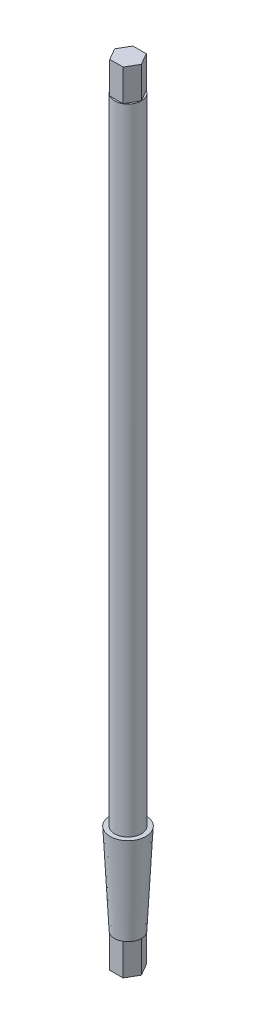
ISO-10303-21;
HEADER;
FILE_DESCRIPTION(('STEP AP214'),'2;1');
FILE_NAME('part.step','',(''),(''),'','','');
FILE_SCHEMA(('AUTOMOTIVE_DESIGN { 1 0 10303 214 1 1 1 1 }'));
ENDSEC;
DATA;
#1=APPLICATION_CONTEXT('core data for automotive mechanical design processes');
#2=APPLICATION_PROTOCOL_DEFINITION('international standard','automotive_design',2000,#1);
#3=PRODUCT_CONTEXT('',#1,'mechanical');
#4=PRODUCT('Part','Part','',(#3));
#5=PRODUCT_RELATED_PRODUCT_CATEGORY('part','',(#4));
#6=PRODUCT_DEFINITION_FORMATION('','',#4);
#7=PRODUCT_DEFINITION_CONTEXT('part definition',#1,'design');
#8=PRODUCT_DEFINITION('design','',#6,#7);
#9=PRODUCT_DEFINITION_SHAPE('','',#8);
#10=(LENGTH_UNIT() NAMED_UNIT(*) SI_UNIT(.MILLI.,.METRE.));
#11=(NAMED_UNIT(*) PLANE_ANGLE_UNIT() SI_UNIT($,.RADIAN.));
#12=(NAMED_UNIT(*) SI_UNIT($,.STERADIAN.) SOLID_ANGLE_UNIT());
#13=UNCERTAINTY_MEASURE_WITH_UNIT(LENGTH_MEASURE(1.E-05),#10,'distance_accuracy_value','');
#14=(GEOMETRIC_REPRESENTATION_CONTEXT(3) GLOBAL_UNCERTAINTY_ASSIGNED_CONTEXT((#13)) GLOBAL_UNIT_ASSIGNED_CONTEXT((#10,
#11,#12)) REPRESENTATION_CONTEXT('',''));
#15=CARTESIAN_POINT('',(0.,0.,0.));
#16=DIRECTION('',(0.,0.,1.));
#17=DIRECTION('',(1.,0.,0.));
#18=AXIS2_PLACEMENT_3D('',#15,#16,#17);
#19=CARTESIAN_POINT('',(0.,167.,0.));
#20=DIRECTION('',(0.,1.,0.));
#21=DIRECTION('',(0.,0.,1.));
#22=AXIS2_PLACEMENT_3D('',#19,#20,#21);
#23=PLANE('',#22);
#24=DIRECTION('',(1.,0.,0.));
#25=VECTOR('',#24,1.);
#26=CARTESIAN_POINT('',(-1.475,167.,2.5547749411641));
#27=LINE('',#26,#25);
#28=CARTESIAN_POINT('',(-1.475,167.,2.55477494116409));
#29=VERTEX_POINT('',#28);
#30=CARTESIAN_POINT('',(1.475,167.,2.5547749411641));
#31=VERTEX_POINT('',#30);
#32=EDGE_CURVE('E57',#29,#31,#27,.T.);
#33=ORIENTED_EDGE('',*,*,#32,.F.);
#34=CARTESIAN_POINT('',(0.,167.,0.));
#35=DIRECTION('',(0.,1.,0.));
#36=DIRECTION('',(0.,0.,1.));
#37=AXIS2_PLACEMENT_3D('',#34,#35,#36);
#38=CIRCLE('',#37,2.95);
#39=EDGE_CURVE('E207',#29,#31,#38,.T.);
#40=ORIENTED_EDGE('',*,*,#39,.T.);
#41=EDGE_LOOP('',(#33,#40));
#42=FACE_BOUND('',#41,.T.);
#43=ADVANCED_FACE('F41',(#42),#23,.T.);
#44=DIRECTION('',(0.5,0.,0.866025403784439));
#45=VECTOR('',#44,1.);
#46=CARTESIAN_POINT('',(-2.95,167.,0.));
#47=LINE('',#46,#45);
#48=CARTESIAN_POINT('',(-2.95,167.,0.));
#49=VERTEX_POINT('',#48);
#50=EDGE_CURVE('E64',#49,#29,#47,.T.);
#51=ORIENTED_EDGE('',*,*,#50,.F.);
#52=EDGE_CURVE('E583',#49,#29,#38,.T.);
#53=ORIENTED_EDGE('',*,*,#52,.T.);
#54=EDGE_LOOP('',(#51,#53));
#55=FACE_BOUND('',#54,.T.);
#56=ADVANCED_FACE('F317',(#55),#23,.T.);
#57=DIRECTION('',(-0.5,0.,0.866025403784439));
#58=VECTOR('',#57,1.);
#59=CARTESIAN_POINT('',(-1.475,167.,-2.55477494116409));
#60=LINE('',#59,#58);
#61=CARTESIAN_POINT('',(-1.475,167.,-2.55477494116409));
#62=VERTEX_POINT('',#61);
#63=EDGE_CURVE('E364',#62,#49,#60,.T.);
#64=ORIENTED_EDGE('',*,*,#63,.F.);
#65=EDGE_CURVE('E577',#62,#49,#38,.T.);
#66=ORIENTED_EDGE('',*,*,#65,.T.);
#67=EDGE_LOOP('',(#64,#66));
#68=FACE_BOUND('',#67,.T.);
#69=ADVANCED_FACE('F321',(#68),#23,.T.);
#70=DIRECTION('',(-1.,0.,0.));
#71=VECTOR('',#70,1.);
#72=CARTESIAN_POINT('',(1.475,167.,-2.55477494116409));
#73=LINE('',#72,#71);
#74=CARTESIAN_POINT('',(1.475,167.,-2.55477494116409));
#75=VERTEX_POINT('',#74);
#76=EDGE_CURVE('E347',#75,#62,#73,.T.);
#77=ORIENTED_EDGE('',*,*,#76,.F.);
#78=EDGE_CURVE('E582',#75,#62,#38,.T.);
#79=ORIENTED_EDGE('',*,*,#78,.T.);
#80=EDGE_LOOP('',(#77,#79));
#81=FACE_BOUND('',#80,.T.);
#82=ADVANCED_FACE('F332',(#81),#23,.T.);
#83=DIRECTION('',(-0.5,0.,-0.866025403784439));
#84=VECTOR('',#83,1.);
#85=CARTESIAN_POINT('',(2.95,167.,0.));
#86=LINE('',#85,#84);
#87=CARTESIAN_POINT('',(2.95,167.,0.));
#88=VERTEX_POINT('',#87);
#89=EDGE_CURVE('E342',#88,#75,#86,.T.);
#90=ORIENTED_EDGE('',*,*,#89,.F.);
#91=EDGE_CURVE('E206',#88,#75,#38,.T.);
#92=ORIENTED_EDGE('',*,*,#91,.T.);
#93=EDGE_LOOP('',(#90,#92));
#94=FACE_BOUND('',#93,.T.);
#95=ADVANCED_FACE('F325',(#94),#23,.T.);
#96=CARTESIAN_POINT('',(-1.475,7.,2.55477494116409));
#97=DIRECTION('',(0.,0.,-1.));
#98=DIRECTION('',(-1.,0.,0.));
#99=AXIS2_PLACEMENT_3D('',#96,#97,#98);
#100=PLANE('',#99);
#101=DIRECTION('',(1.,0.,0.));
#102=VECTOR('',#101,1.);
#103=CARTESIAN_POINT('',(-1.475,0.,2.55477494116409));
#104=LINE('',#103,#102);
#105=CARTESIAN_POINT('',(-1.475,0.,2.55477494116409));
#106=VERTEX_POINT('',#105);
#107=CARTESIAN_POINT('',(1.475,0.,2.55477494116409));
#108=VERTEX_POINT('',#107);
#109=EDGE_CURVE('E205',#106,#108,#104,.T.);
#110=ORIENTED_EDGE('',*,*,#109,.T.);
#111=DIRECTION('',(0.,-1.,0.));
#112=VECTOR('',#111,1.);
#113=CARTESIAN_POINT('',(1.475,7.,2.55477494116409));
#114=LINE('',#113,#112);
#115=CARTESIAN_POINT('',(1.4750000000812,7.,2.55477494111721));
#116=VERTEX_POINT('',#115);
#117=EDGE_CURVE('E50',#116,#108,#114,.T.);
#118=ORIENTED_EDGE('',*,*,#117,.F.);
#119=DIRECTION('',(1.,0.,0.));
#120=VECTOR('',#119,1.);
#121=CARTESIAN_POINT('',(-1.475,7.,2.55477494116409));
#122=LINE('',#121,#120);
#123=CARTESIAN_POINT('',(-1.47500000011062,7.,2.55477494110023));
#124=VERTEX_POINT('',#123);
#125=EDGE_CURVE('E219',#124,#116,#122,.T.);
#126=ORIENTED_EDGE('',*,*,#125,.F.);
#127=DIRECTION('',(0.,-1.,0.));
#128=VECTOR('',#127,1.);
#129=CARTESIAN_POINT('',(-1.475,7.,2.55477494116409));
#130=LINE('',#129,#128);
#131=EDGE_CURVE('E224',#124,#106,#130,.T.);
#132=ORIENTED_EDGE('',*,*,#131,.T.);
#133=EDGE_LOOP('',(#110,#118,#126,#132));
#134=FACE_BOUND('',#133,.T.);
#135=ADVANCED_FACE('F43',(#134),#100,.F.);
#136=CARTESIAN_POINT('',(1.475,7.,2.55477494116409));
#137=DIRECTION('',(-0.866025403784439,0.,-0.5));
#138=DIRECTION('',(-0.5,0.,0.866025403784439));
#139=AXIS2_PLACEMENT_3D('',#136,#137,#138);
#140=PLANE('',#139);
#141=DIRECTION('',(0.5,0.,-0.866025403784439));
#142=VECTOR('',#141,1.);
#143=CARTESIAN_POINT('',(1.475,0.,2.55477494116409));
#144=LINE('',#143,#142);
#145=CARTESIAN_POINT('',(2.95,0.,0.));
#146=VERTEX_POINT('',#145);
#147=EDGE_CURVE('E210',#108,#146,#144,.T.);
#148=ORIENTED_EDGE('',*,*,#147,.T.);
#149=DIRECTION('',(0.,-1.,0.));
#150=VECTOR('',#149,1.);
#151=CARTESIAN_POINT('',(2.95,7.,0.));
#152=LINE('',#151,#150);
#153=CARTESIAN_POINT('',(2.95,7.,0.));
#154=VERTEX_POINT('',#153);
#155=EDGE_CURVE('E246',#154,#146,#152,.T.);
#156=ORIENTED_EDGE('',*,*,#155,.F.);
#157=DIRECTION('',(0.5,0.,-0.866025403784439));
#158=VECTOR('',#157,1.);
#159=CARTESIAN_POINT('',(1.475,7.,2.55477494116409));
#160=LINE('',#159,#158);
#161=EDGE_CURVE('E231',#116,#154,#160,.T.);
#162=ORIENTED_EDGE('',*,*,#161,.F.);
#163=ORIENTED_EDGE('',*,*,#117,.T.);
#164=EDGE_LOOP('',(#148,#156,#162,#163));
#165=FACE_BOUND('',#164,.T.);
#166=ADVANCED_FACE('F307',(#165),#140,.F.);
#167=CARTESIAN_POINT('',(2.95,7.,0.));
#168=DIRECTION('',(-0.866025403784439,0.,0.5));
#169=DIRECTION('',(0.5,0.,0.866025403784439));
#170=AXIS2_PLACEMENT_3D('',#167,#168,#169);
#171=PLANE('',#170);
#172=DIRECTION('',(-0.5,0.,-0.866025403784439));
#173=VECTOR('',#172,1.);
#174=CARTESIAN_POINT('',(2.95,0.,0.));
#175=LINE('',#174,#173);
#176=CARTESIAN_POINT('',(1.475,0.,-2.55477494116409));
#177=VERTEX_POINT('',#176);
#178=EDGE_CURVE('E212',#146,#177,#175,.T.);
#179=ORIENTED_EDGE('',*,*,#178,.T.);
#180=DIRECTION('',(0.,-1.,0.));
#181=VECTOR('',#180,1.);
#182=CARTESIAN_POINT('',(1.475,7.,-2.55477494116409));
#183=LINE('',#182,#181);
#184=CARTESIAN_POINT('',(1.47500000011062,7.,-2.55477494110023));
#185=VERTEX_POINT('',#184);
#186=EDGE_CURVE('E240',#185,#177,#183,.T.);
#187=ORIENTED_EDGE('',*,*,#186,.F.);
#188=DIRECTION('',(-0.5,0.,-0.866025403784439));
#189=VECTOR('',#188,1.);
#190=CARTESIAN_POINT('',(2.95,7.,0.));
#191=LINE('',#190,#189);
#192=EDGE_CURVE('E243',#154,#185,#191,.T.);
#193=ORIENTED_EDGE('',*,*,#192,.F.);
#194=ORIENTED_EDGE('',*,*,#155,.T.);
#195=EDGE_LOOP('',(#179,#187,#193,#194));
#196=FACE_BOUND('',#195,.T.);
#197=ADVANCED_FACE('F308',(#196),#171,.F.);
#198=CARTESIAN_POINT('',(1.475,7.,-2.55477494116409));
#199=DIRECTION('',(0.,0.,1.));
#200=DIRECTION('',(1.,0.,0.));
#201=AXIS2_PLACEMENT_3D('',#198,#199,#200);
#202=PLANE('',#201);
#203=DIRECTION('',(-1.,0.,0.));
#204=VECTOR('',#203,1.);
#205=CARTESIAN_POINT('',(1.475,0.,-2.55477494116409));
#206=LINE('',#205,#204);
#207=CARTESIAN_POINT('',(-1.475,0.,-2.55477494116409));
#208=VERTEX_POINT('',#207);
#209=EDGE_CURVE('E214',#177,#208,#206,.T.);
#210=ORIENTED_EDGE('',*,*,#209,.T.);
#211=DIRECTION('',(0.,-1.,0.));
#212=VECTOR('',#211,1.);
#213=CARTESIAN_POINT('',(-1.475,7.,-2.55477494116409));
#214=LINE('',#213,#212);
#215=CARTESIAN_POINT('',(-1.4750000000812,7.,-2.55477494111721));
#216=VERTEX_POINT('',#215);
#217=EDGE_CURVE('E234',#216,#208,#214,.T.);
#218=ORIENTED_EDGE('',*,*,#217,.F.);
#219=DIRECTION('',(-1.,0.,0.));
#220=VECTOR('',#219,1.);
#221=CARTESIAN_POINT('',(1.475,7.,-2.55477494116409));
#222=LINE('',#221,#220);
#223=EDGE_CURVE('E237',#185,#216,#222,.T.);
#224=ORIENTED_EDGE('',*,*,#223,.F.);
#225=ORIENTED_EDGE('',*,*,#186,.T.);
#226=EDGE_LOOP('',(#210,#218,#224,#225));
#227=FACE_BOUND('',#226,.T.);
#228=ADVANCED_FACE('F299',(#227),#202,.F.);
#229=CARTESIAN_POINT('',(-1.475,7.,-2.55477494116409));
#230=DIRECTION('',(0.866025403784439,0.,0.5));
#231=DIRECTION('',(0.5,0.,-0.866025403784439));
#232=AXIS2_PLACEMENT_3D('',#229,#230,#231);
#233=PLANE('',#232);
#234=DIRECTION('',(-0.5,0.,0.866025403784439));
#235=VECTOR('',#234,1.);
#236=CARTESIAN_POINT('',(-1.475,0.,-2.55477494116409));
#237=LINE('',#236,#235);
#238=CARTESIAN_POINT('',(-2.95,0.,0.));
#239=VERTEX_POINT('',#238);
#240=EDGE_CURVE('E216',#208,#239,#237,.T.);
#241=ORIENTED_EDGE('',*,*,#240,.T.);
#242=DIRECTION('',(0.,-1.,0.));
#243=VECTOR('',#242,1.);
#244=CARTESIAN_POINT('',(-2.95,7.,0.));
#245=LINE('',#244,#243);
#246=CARTESIAN_POINT('',(-2.95,7.,0.));
#247=VERTEX_POINT('',#246);
#248=EDGE_CURVE('E228',#247,#239,#245,.T.);
#249=ORIENTED_EDGE('',*,*,#248,.F.);
#250=DIRECTION('',(-0.5,0.,0.866025403784439));
#251=VECTOR('',#250,1.);
#252=CARTESIAN_POINT('',(-1.475,7.,-2.55477494116409));
#253=LINE('',#252,#251);
#254=EDGE_CURVE('E225',#216,#247,#253,.T.);
#255=ORIENTED_EDGE('',*,*,#254,.F.);
#256=ORIENTED_EDGE('',*,*,#217,.T.);
#257=EDGE_LOOP('',(#241,#249,#255,#256));
#258=FACE_BOUND('',#257,.T.);
#259=ADVANCED_FACE('F302',(#258),#233,.F.);
#260=CARTESIAN_POINT('',(-2.95,7.,0.));
#261=DIRECTION('',(0.866025403784439,0.,-0.5));
#262=DIRECTION('',(-0.5,0.,-0.866025403784439));
#263=AXIS2_PLACEMENT_3D('',#260,#261,#262);
#264=PLANE('',#263);
#265=DIRECTION('',(0.5,0.,0.866025403784439));
#266=VECTOR('',#265,1.);
#267=CARTESIAN_POINT('',(-2.95,0.,0.));
#268=LINE('',#267,#266);
#269=EDGE_CURVE('E218',#239,#106,#268,.T.);
#270=ORIENTED_EDGE('',*,*,#269,.T.);
#271=ORIENTED_EDGE('',*,*,#131,.F.);
#272=DIRECTION('',(0.5,0.,0.866025403784439));
#273=VECTOR('',#272,1.);
#274=CARTESIAN_POINT('',(-2.95,7.,0.));
#275=LINE('',#274,#273);
#276=EDGE_CURVE('E221',#247,#124,#275,.T.);
#277=ORIENTED_EDGE('',*,*,#276,.F.);
#278=ORIENTED_EDGE('',*,*,#248,.T.);
#279=EDGE_LOOP('',(#270,#271,#277,#278));
#280=FACE_BOUND('',#279,.T.);
#281=ADVANCED_FACE('F280',(#280),#264,.F.);
#282=CARTESIAN_POINT('',(0.,0.,0.));
#283=DIRECTION('',(0.,1.,0.));
#284=DIRECTION('',(0.,0.,1.));
#285=AXIS2_PLACEMENT_3D('',#282,#283,#284);
#286=PLANE('',#285);
#287=ORIENTED_EDGE('',*,*,#109,.F.);
#288=ORIENTED_EDGE('',*,*,#269,.F.);
#289=ORIENTED_EDGE('',*,*,#240,.F.);
#290=ORIENTED_EDGE('',*,*,#209,.F.);
#291=ORIENTED_EDGE('',*,*,#178,.F.);
#292=ORIENTED_EDGE('',*,*,#147,.F.);
#293=EDGE_LOOP('',(#287,#288,#289,#290,#291,#292));
#294=FACE_BOUND('',#293,.T.);
#295=ADVANCED_FACE('F304',(#294),#286,.F.);
#296=CARTESIAN_POINT('',(0.,7.,0.));
#297=DIRECTION('',(0.,1.,0.));
#298=DIRECTION('',(0.,0.,1.));
#299=AXIS2_PLACEMENT_3D('',#296,#297,#298);
#300=PLANE('',#299);
#301=CARTESIAN_POINT('',(0.,7.,0.));
#302=DIRECTION('',(0.,1.,0.));
#303=DIRECTION('',(0.,0.,1.));
#304=AXIS2_PLACEMENT_3D('',#301,#302,#303);
#305=CIRCLE('',#304,2.95);
#306=EDGE_CURVE('E159',#124,#116,#305,.T.);
#307=ORIENTED_EDGE('',*,*,#306,.F.);
#308=ORIENTED_EDGE('',*,*,#125,.T.);
#309=EDGE_LOOP('',(#307,#308));
#310=FACE_BOUND('',#309,.T.);
#311=ADVANCED_FACE('F287',(#310),#300,.F.);
#312=CARTESIAN_POINT('',(0.,7.,0.));
#313=DIRECTION('',(0.,1.,0.));
#314=DIRECTION('',(0.,0.,1.));
#315=AXIS2_PLACEMENT_3D('',#312,#313,#314);
#316=CIRCLE('',#315,2.95);
#317=EDGE_CURVE('E260',#116,#154,#316,.T.);
#318=ORIENTED_EDGE('',*,*,#317,.F.);
#319=ORIENTED_EDGE('',*,*,#161,.T.);
#320=EDGE_LOOP('',(#318,#319));
#321=FACE_BOUND('',#320,.T.);
#322=ADVANCED_FACE('F289',(#321),#300,.F.);
#323=CARTESIAN_POINT('',(0.,7.,0.));
#324=DIRECTION('',(0.,1.,0.));
#325=DIRECTION('',(0.,0.,1.));
#326=AXIS2_PLACEMENT_3D('',#323,#324,#325);
#327=CIRCLE('',#326,2.95);
#328=EDGE_CURVE('E263',#154,#185,#327,.T.);
#329=ORIENTED_EDGE('',*,*,#328,.F.);
#330=ORIENTED_EDGE('',*,*,#192,.T.);
#331=EDGE_LOOP('',(#329,#330));
#332=FACE_BOUND('',#331,.T.);
#333=ADVANCED_FACE('F292',(#332),#300,.F.);
#334=CARTESIAN_POINT('',(0.,7.,0.));
#335=DIRECTION('',(0.,1.,0.));
#336=DIRECTION('',(0.,0.,1.));
#337=AXIS2_PLACEMENT_3D('',#334,#335,#336);
#338=CIRCLE('',#337,2.95);
#339=EDGE_CURVE('E265',#185,#216,#338,.T.);
#340=ORIENTED_EDGE('',*,*,#339,.F.);
#341=ORIENTED_EDGE('',*,*,#223,.T.);
#342=EDGE_LOOP('',(#340,#341));
#343=FACE_BOUND('',#342,.T.);
#344=ADVANCED_FACE('F296',(#343),#300,.F.);
#345=CARTESIAN_POINT('',(0.,7.,0.));
#346=DIRECTION('',(0.,1.,0.));
#347=DIRECTION('',(0.,0.,1.));
#348=AXIS2_PLACEMENT_3D('',#345,#346,#347);
#349=CIRCLE('',#348,2.95);
#350=EDGE_CURVE('E45',#216,#247,#349,.T.);
#351=ORIENTED_EDGE('',*,*,#350,.F.);
#352=ORIENTED_EDGE('',*,*,#254,.T.);
#353=EDGE_LOOP('',(#351,#352));
#354=FACE_BOUND('',#353,.T.);
#355=ADVANCED_FACE('F272',(#354),#300,.F.);
#356=CARTESIAN_POINT('',(0.,7.,0.));
#357=DIRECTION('',(0.,1.,0.));
#358=DIRECTION('',(0.,0.,1.));
#359=AXIS2_PLACEMENT_3D('',#356,#357,#358);
#360=CIRCLE('',#359,2.95);
#361=EDGE_CURVE('E255',#247,#124,#360,.T.);
#362=ORIENTED_EDGE('',*,*,#361,.F.);
#363=ORIENTED_EDGE('',*,*,#276,.T.);
#364=EDGE_LOOP('',(#362,#363));
#365=FACE_BOUND('',#364,.T.);
#366=ADVANCED_FACE('F190',(#365),#300,.F.);
#367=CARTESIAN_POINT('',(0.,27.,0.));
#368=DIRECTION('',(0.,-1.,0.));
#369=DIRECTION('',(0.,0.,-1.));
#370=AXIS2_PLACEMENT_3D('',#367,#368,#369);
#371=PLANE('',#370);
#372=CARTESIAN_POINT('',(0.,27.,0.));
#373=DIRECTION('',(0.,-1.,0.));
#374=DIRECTION('',(0.,0.,-1.));
#375=AXIS2_PLACEMENT_3D('',#372,#373,#374);
#376=CIRCLE('',#375,2.95);
#377=CARTESIAN_POINT('',(0.,27.,-2.95));
#378=VERTEX_POINT('',#377);
#379=EDGE_CURVE('E12',#378,#378,#376,.T.);
#380=ORIENTED_EDGE('',*,*,#379,.T.);
#381=EDGE_LOOP('',(#380));
#382=FACE_BOUND('',#381,.T.);
#383=CARTESIAN_POINT('',(0.,27.,0.));
#384=DIRECTION('',(0.,-1.,0.));
#385=DIRECTION('',(0.,0.,-1.));
#386=AXIS2_PLACEMENT_3D('',#383,#384,#385);
#387=CIRCLE('',#386,3.95);
#388=CARTESIAN_POINT('',(0.,27.,-3.95));
#389=VERTEX_POINT('',#388);
#390=EDGE_CURVE('E156',#389,#389,#387,.T.);
#391=ORIENTED_EDGE('',*,*,#390,.F.);
#392=EDGE_LOOP('',(#391));
#393=FACE_BOUND('',#392,.T.);
#394=ADVANCED_FACE('F184',(#382,#393),#371,.F.);
#395=CARTESIAN_POINT('',(0.,7.,0.));
#396=DIRECTION('',(0.,1.,0.));
#397=DIRECTION('',(0.,0.,1.));
#398=AXIS2_PLACEMENT_3D('',#395,#396,#397);
#399=CONICAL_SURFACE('',#398,2.95,0.0499583957219427);
#400=ORIENTED_EDGE('',*,*,#328,.T.);
#401=ORIENTED_EDGE('',*,*,#339,.T.);
#402=ORIENTED_EDGE('',*,*,#350,.T.);
#403=ORIENTED_EDGE('',*,*,#361,.T.);
#404=ORIENTED_EDGE('',*,*,#306,.T.);
#405=ORIENTED_EDGE('',*,*,#317,.T.);
#406=EDGE_LOOP('',(#400,#401,#402,#403,#404,#405));
#407=FACE_BOUND('',#406,.T.);
#408=ORIENTED_EDGE('',*,*,#390,.T.);
#409=EDGE_LOOP('',(#408));
#410=FACE_BOUND('',#409,.T.);
#411=ADVANCED_FACE('F173',(#407,#410),#399,.T.);
#412=DIRECTION('',(0.5,0.,-0.866025403784438));
#413=VECTOR('',#412,1.);
#414=CARTESIAN_POINT('',(1.475,167.,2.55477494116409));
#415=LINE('',#414,#413);
#416=EDGE_CURVE('E348',#31,#88,#415,.T.);
#417=ORIENTED_EDGE('',*,*,#416,.F.);
#418=EDGE_CURVE('E203',#31,#88,#38,.T.);
#419=ORIENTED_EDGE('',*,*,#418,.T.);
#420=EDGE_LOOP('',(#417,#419));
#421=FACE_BOUND('',#420,.T.);
#422=ADVANCED_FACE('F183',(#421),#23,.T.);
#423=CARTESIAN_POINT('',(0.,167.,0.));
#424=DIRECTION('',(0.,-1.,0.));
#425=DIRECTION('',(0.,0.,-1.));
#426=AXIS2_PLACEMENT_3D('',#423,#424,#425);
#427=CYLINDRICAL_SURFACE('',#426,2.95);
#428=ORIENTED_EDGE('',*,*,#418,.F.);
#429=ORIENTED_EDGE('',*,*,#39,.F.);
#430=ORIENTED_EDGE('',*,*,#52,.F.);
#431=ORIENTED_EDGE('',*,*,#65,.F.);
#432=ORIENTED_EDGE('',*,*,#78,.F.);
#433=ORIENTED_EDGE('',*,*,#91,.F.);
#434=EDGE_LOOP('',(#428,#429,#430,#431,#432,#433));
#435=FACE_BOUND('',#434,.T.);
#436=ORIENTED_EDGE('',*,*,#379,.F.);
#437=EDGE_LOOP('',(#436));
#438=FACE_BOUND('',#437,.T.);
#439=ADVANCED_FACE('F323',(#435,#438),#427,.T.);
#440=CARTESIAN_POINT('',(-1.475,174.,2.5547749411641));
#441=DIRECTION('',(0.,0.,-1.));
#442=DIRECTION('',(-1.,0.,0.));
#443=AXIS2_PLACEMENT_3D('',#440,#441,#442);
#444=PLANE('',#443);
#445=ORIENTED_EDGE('',*,*,#32,.T.);
#446=DIRECTION('',(0.,-1.,0.));
#447=VECTOR('',#446,1.);
#448=CARTESIAN_POINT('',(1.475,174.,2.55477494116409));
#449=LINE('',#448,#447);
#450=CARTESIAN_POINT('',(1.475,174.,2.55477494116409));
#451=VERTEX_POINT('',#450);
#452=EDGE_CURVE('E139',#451,#31,#449,.T.);
#453=ORIENTED_EDGE('',*,*,#452,.F.);
#454=DIRECTION('',(1.,0.,0.));
#455=VECTOR('',#454,1.);
#456=CARTESIAN_POINT('',(-1.475,174.,2.5547749411641));
#457=LINE('',#456,#455);
#458=CARTESIAN_POINT('',(-1.475,174.,2.5547749411641));
#459=VERTEX_POINT('',#458);
#460=EDGE_CURVE('E145',#459,#451,#457,.T.);
#461=ORIENTED_EDGE('',*,*,#460,.F.);
#462=DIRECTION('',(0.,-1.,0.));
#463=VECTOR('',#462,1.);
#464=CARTESIAN_POINT('',(-1.475,174.,2.5547749411641));
#465=LINE('',#464,#463);
#466=EDGE_CURVE('E360',#459,#29,#465,.T.);
#467=ORIENTED_EDGE('',*,*,#466,.T.);
#468=EDGE_LOOP('',(#445,#453,#461,#467));
#469=FACE_BOUND('',#468,.T.);
#470=ADVANCED_FACE('F155',(#469),#444,.F.);
#471=CARTESIAN_POINT('',(1.475,174.,2.55477494116409));
#472=DIRECTION('',(-0.866025403784438,0.,-0.5));
#473=DIRECTION('',(-0.5,0.,0.866025403784439));
#474=AXIS2_PLACEMENT_3D('',#471,#472,#473);
#475=PLANE('',#474);
#476=ORIENTED_EDGE('',*,*,#416,.T.);
#477=DIRECTION('',(0.,-1.,0.));
#478=VECTOR('',#477,1.);
#479=CARTESIAN_POINT('',(2.95,174.,0.));
#480=LINE('',#479,#478);
#481=CARTESIAN_POINT('',(2.95,174.,0.));
#482=VERTEX_POINT('',#481);
#483=EDGE_CURVE('E141',#482,#88,#480,.T.);
#484=ORIENTED_EDGE('',*,*,#483,.F.);
#485=DIRECTION('',(0.5,0.,-0.866025403784438));
#486=VECTOR('',#485,1.);
#487=CARTESIAN_POINT('',(1.475,174.,2.55477494116409));
#488=LINE('',#487,#486);
#489=EDGE_CURVE('E134',#451,#482,#488,.T.);
#490=ORIENTED_EDGE('',*,*,#489,.F.);
#491=ORIENTED_EDGE('',*,*,#452,.T.);
#492=EDGE_LOOP('',(#476,#484,#490,#491));
#493=FACE_BOUND('',#492,.T.);
#494=ADVANCED_FACE('F137',(#493),#475,.F.);
#495=CARTESIAN_POINT('',(2.95,174.,0.));
#496=DIRECTION('',(-0.866025403784439,0.,0.5));
#497=DIRECTION('',(0.5,0.,0.866025403784439));
#498=AXIS2_PLACEMENT_3D('',#495,#496,#497);
#499=PLANE('',#498);
#500=ORIENTED_EDGE('',*,*,#89,.T.);
#501=DIRECTION('',(0.,-1.,0.));
#502=VECTOR('',#501,1.);
#503=CARTESIAN_POINT('',(1.475,174.,-2.55477494116409));
#504=LINE('',#503,#502);
#505=CARTESIAN_POINT('',(1.475,174.,-2.55477494116409));
#506=VERTEX_POINT('',#505);
#507=EDGE_CURVE('E161',#506,#75,#504,.T.);
#508=ORIENTED_EDGE('',*,*,#507,.F.);
#509=DIRECTION('',(-0.5,0.,-0.866025403784439));
#510=VECTOR('',#509,1.);
#511=CARTESIAN_POINT('',(2.95,174.,0.));
#512=LINE('',#511,#510);
#513=EDGE_CURVE('E144',#482,#506,#512,.T.);
#514=ORIENTED_EDGE('',*,*,#513,.F.);
#515=ORIENTED_EDGE('',*,*,#483,.T.);
#516=EDGE_LOOP('',(#500,#508,#514,#515));
#517=FACE_BOUND('',#516,.T.);
#518=ADVANCED_FACE('F351',(#517),#499,.F.);
#519=CARTESIAN_POINT('',(1.475,174.,-2.55477494116409));
#520=DIRECTION('',(0.,0.,1.));
#521=DIRECTION('',(1.,0.,0.));
#522=AXIS2_PLACEMENT_3D('',#519,#520,#521);
#523=PLANE('',#522);
#524=ORIENTED_EDGE('',*,*,#76,.T.);
#525=DIRECTION('',(0.,-1.,0.));
#526=VECTOR('',#525,1.);
#527=CARTESIAN_POINT('',(-1.475,174.,-2.55477494116409));
#528=LINE('',#527,#526);
#529=CARTESIAN_POINT('',(-1.475,174.,-2.55477494116409));
#530=VERTEX_POINT('',#529);
#531=EDGE_CURVE('E372',#530,#62,#528,.T.);
#532=ORIENTED_EDGE('',*,*,#531,.F.);
#533=DIRECTION('',(-1.,0.,0.));
#534=VECTOR('',#533,1.);
#535=CARTESIAN_POINT('',(1.475,174.,-2.55477494116409));
#536=LINE('',#535,#534);
#537=EDGE_CURVE('E353',#506,#530,#536,.T.);
#538=ORIENTED_EDGE('',*,*,#537,.F.);
#539=ORIENTED_EDGE('',*,*,#507,.T.);
#540=EDGE_LOOP('',(#524,#532,#538,#539));
#541=FACE_BOUND('',#540,.T.);
#542=ADVANCED_FACE('F375',(#541),#523,.F.);
#543=CARTESIAN_POINT('',(-1.475,174.,-2.55477494116409));
#544=DIRECTION('',(0.866025403784439,0.,0.5));
#545=DIRECTION('',(0.5,0.,-0.866025403784439));
#546=AXIS2_PLACEMENT_3D('',#543,#544,#545);
#547=PLANE('',#546);
#548=ORIENTED_EDGE('',*,*,#63,.T.);
#549=DIRECTION('',(0.,-1.,0.));
#550=VECTOR('',#549,1.);
#551=CARTESIAN_POINT('',(-2.95,174.,0.));
#552=LINE('',#551,#550);
#553=CARTESIAN_POINT('',(-2.95,174.,0.));
#554=VERTEX_POINT('',#553);
#555=EDGE_CURVE('E369',#554,#49,#552,.T.);
#556=ORIENTED_EDGE('',*,*,#555,.F.);
#557=DIRECTION('',(-0.5,0.,0.866025403784439));
#558=VECTOR('',#557,1.);
#559=CARTESIAN_POINT('',(-1.475,174.,-2.55477494116409));
#560=LINE('',#559,#558);
#561=EDGE_CURVE('E355',#530,#554,#560,.T.);
#562=ORIENTED_EDGE('',*,*,#561,.F.);
#563=ORIENTED_EDGE('',*,*,#531,.T.);
#564=EDGE_LOOP('',(#548,#556,#562,#563));
#565=FACE_BOUND('',#564,.T.);
#566=ADVANCED_FACE('F380',(#565),#547,.F.);
#567=CARTESIAN_POINT('',(-2.95,174.,0.));
#568=DIRECTION('',(0.866025403784439,0.,-0.5));
#569=DIRECTION('',(-0.5,0.,-0.866025403784439));
#570=AXIS2_PLACEMENT_3D('',#567,#568,#569);
#571=PLANE('',#570);
#572=ORIENTED_EDGE('',*,*,#50,.T.);
#573=ORIENTED_EDGE('',*,*,#466,.F.);
#574=DIRECTION('',(0.5,0.,0.866025403784439));
#575=VECTOR('',#574,1.);
#576=CARTESIAN_POINT('',(-2.95,174.,0.));
#577=LINE('',#576,#575);
#578=EDGE_CURVE('E150',#554,#459,#577,.T.);
#579=ORIENTED_EDGE('',*,*,#578,.F.);
#580=ORIENTED_EDGE('',*,*,#555,.T.);
#581=EDGE_LOOP('',(#572,#573,#579,#580));
#582=FACE_BOUND('',#581,.T.);
#583=ADVANCED_FACE('F382',(#582),#571,.F.);
#584=CARTESIAN_POINT('',(0.,174.,0.));
#585=DIRECTION('',(0.,1.,0.));
#586=DIRECTION('',(0.,0.,1.));
#587=AXIS2_PLACEMENT_3D('',#584,#585,#586);
#588=PLANE('',#587);
#589=ORIENTED_EDGE('',*,*,#460,.T.);
#590=ORIENTED_EDGE('',*,*,#489,.T.);
#591=ORIENTED_EDGE('',*,*,#513,.T.);
#592=ORIENTED_EDGE('',*,*,#537,.T.);
#593=ORIENTED_EDGE('',*,*,#561,.T.);
#594=ORIENTED_EDGE('',*,*,#578,.T.);
#595=EDGE_LOOP('',(#589,#590,#591,#592,#593,#594));
#596=FACE_BOUND('',#595,.T.);
#597=ADVANCED_FACE('F148',(#596),#588,.T.);
#598=CLOSED_SHELL('',(#43,#56,#69,#82,#95,#135,#166,#197,#228,#259,#281,#295,#311,#322,#333,
#344,#355,#366,#394,#411,#422,#439,#470,#494,#518,#542,#566,#583,#597));
#599=MANIFOLD_SOLID_BREP('B2',#598);
#600=ADVANCED_BREP_SHAPE_REPRESENTATION('',(#18,#599),#14);
#601=SHAPE_DEFINITION_REPRESENTATION(#9,#600);
ENDSEC;
END-ISO-10303-21;
